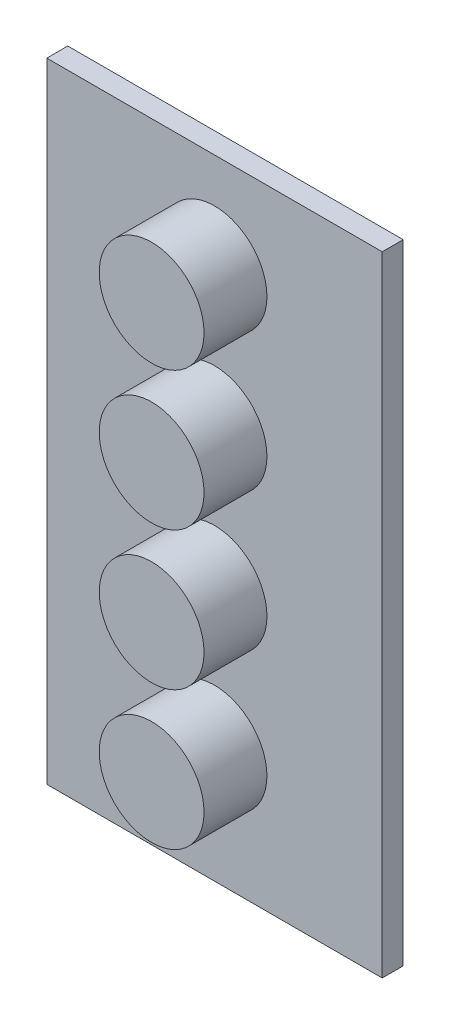
ISO-10303-21;
HEADER;
FILE_DESCRIPTION(('STEP AP214'),'2;1');
FILE_NAME('part.step','',(''),(''),'','','');
FILE_SCHEMA(('AUTOMOTIVE_DESIGN { 1 0 10303 214 1 1 1 1 }'));
ENDSEC;
DATA;
#1=APPLICATION_CONTEXT('core data for automotive mechanical design processes');
#2=APPLICATION_PROTOCOL_DEFINITION('international standard','automotive_design',2000,#1);
#3=PRODUCT_CONTEXT('',#1,'mechanical');
#4=PRODUCT('Part','Part','',(#3));
#5=PRODUCT_RELATED_PRODUCT_CATEGORY('part','',(#4));
#6=PRODUCT_DEFINITION_FORMATION('','',#4);
#7=PRODUCT_DEFINITION_CONTEXT('part definition',#1,'design');
#8=PRODUCT_DEFINITION('design','',#6,#7);
#9=PRODUCT_DEFINITION_SHAPE('','',#8);
#10=(LENGTH_UNIT() NAMED_UNIT(*) SI_UNIT(.MILLI.,.METRE.));
#11=(NAMED_UNIT(*) PLANE_ANGLE_UNIT() SI_UNIT($,.RADIAN.));
#12=(NAMED_UNIT(*) SI_UNIT($,.STERADIAN.) SOLID_ANGLE_UNIT());
#13=UNCERTAINTY_MEASURE_WITH_UNIT(LENGTH_MEASURE(1.E-05),#10,'distance_accuracy_value','');
#14=(GEOMETRIC_REPRESENTATION_CONTEXT(3) GLOBAL_UNCERTAINTY_ASSIGNED_CONTEXT((#13)) GLOBAL_UNIT_ASSIGNED_CONTEXT((#10,
#11,#12)) REPRESENTATION_CONTEXT('',''));
#15=CARTESIAN_POINT('',(0.,0.,0.));
#16=DIRECTION('',(0.,0.,1.));
#17=DIRECTION('',(1.,0.,0.));
#18=AXIS2_PLACEMENT_3D('',#15,#16,#17);
#19=CARTESIAN_POINT('',(40.,75.,5.));
#20=DIRECTION('',(-1.,0.,0.));
#21=DIRECTION('',(0.,-1.,0.));
#22=AXIS2_PLACEMENT_3D('',#19,#20,#21);
#23=PLANE('',#22);
#24=DIRECTION('',(0.,1.,0.));
#25=VECTOR('',#24,1.);
#26=CARTESIAN_POINT('',(40.,75.,0.));
#27=LINE('',#26,#25);
#28=CARTESIAN_POINT('',(40.,-75.,0.));
#29=VERTEX_POINT('',#28);
#30=CARTESIAN_POINT('',(40.,75.,0.));
#31=VERTEX_POINT('',#30);
#32=EDGE_CURVE('E97',#29,#31,#27,.T.);
#33=ORIENTED_EDGE('',*,*,#32,.T.);
#34=DIRECTION('',(0.,0.,-1.));
#35=VECTOR('',#34,1.);
#36=CARTESIAN_POINT('',(40.,75.,5.));
#37=LINE('',#36,#35);
#38=CARTESIAN_POINT('',(40.,75.,5.));
#39=VERTEX_POINT('',#38);
#40=EDGE_CURVE('E11',#39,#31,#37,.T.);
#41=ORIENTED_EDGE('',*,*,#40,.F.);
#42=DIRECTION('',(0.,1.,0.));
#43=VECTOR('',#42,1.);
#44=CARTESIAN_POINT('',(40.,75.,5.));
#45=LINE('',#44,#43);
#46=CARTESIAN_POINT('',(40.,-75.,5.));
#47=VERTEX_POINT('',#46);
#48=EDGE_CURVE('E85',#47,#39,#45,.T.);
#49=ORIENTED_EDGE('',*,*,#48,.F.);
#50=DIRECTION('',(0.,0.,-1.));
#51=VECTOR('',#50,1.);
#52=CARTESIAN_POINT('',(40.,-75.,5.));
#53=LINE('',#52,#51);
#54=EDGE_CURVE('E93',#47,#29,#53,.T.);
#55=ORIENTED_EDGE('',*,*,#54,.T.);
#56=EDGE_LOOP('',(#33,#41,#49,#55));
#57=FACE_BOUND('',#56,.T.);
#58=ADVANCED_FACE('F34',(#57),#23,.F.);
#59=CARTESIAN_POINT('',(-40.,75.,5.));
#60=DIRECTION('',(0.,-1.,0.));
#61=DIRECTION('',(0.,0.,-1.));
#62=AXIS2_PLACEMENT_3D('',#59,#60,#61);
#63=PLANE('',#62);
#64=DIRECTION('',(-1.,0.,0.));
#65=VECTOR('',#64,1.);
#66=CARTESIAN_POINT('',(-40.,75.,0.));
#67=LINE('',#66,#65);
#68=CARTESIAN_POINT('',(-40.,75.,0.));
#69=VERTEX_POINT('',#68);
#70=EDGE_CURVE('E89',#31,#69,#67,.T.);
#71=ORIENTED_EDGE('',*,*,#70,.T.);
#72=DIRECTION('',(0.,0.,-1.));
#73=VECTOR('',#72,1.);
#74=CARTESIAN_POINT('',(-40.,75.,5.));
#75=LINE('',#74,#73);
#76=CARTESIAN_POINT('',(-40.,75.,5.));
#77=VERTEX_POINT('',#76);
#78=EDGE_CURVE('E42',#77,#69,#75,.T.);
#79=ORIENTED_EDGE('',*,*,#78,.F.);
#80=DIRECTION('',(-1.,0.,0.));
#81=VECTOR('',#80,1.);
#82=CARTESIAN_POINT('',(-40.,75.,5.));
#83=LINE('',#82,#81);
#84=EDGE_CURVE('E80',#39,#77,#83,.T.);
#85=ORIENTED_EDGE('',*,*,#84,.F.);
#86=ORIENTED_EDGE('',*,*,#40,.T.);
#87=EDGE_LOOP('',(#71,#79,#85,#86));
#88=FACE_BOUND('',#87,.T.);
#89=ADVANCED_FACE('F88',(#88),#63,.F.);
#90=CARTESIAN_POINT('',(-40.,75.,5.));
#91=DIRECTION('',(1.,0.,0.));
#92=DIRECTION('',(0.,1.,0.));
#93=AXIS2_PLACEMENT_3D('',#90,#91,#92);
#94=PLANE('',#93);
#95=DIRECTION('',(0.,-1.,0.));
#96=VECTOR('',#95,1.);
#97=CARTESIAN_POINT('',(-40.,75.,0.));
#98=LINE('',#97,#96);
#99=CARTESIAN_POINT('',(-40.,-75.,0.));
#100=VERTEX_POINT('',#99);
#101=EDGE_CURVE('E67',#69,#100,#98,.T.);
#102=ORIENTED_EDGE('',*,*,#101,.T.);
#103=DIRECTION('',(0.,0.,-1.));
#104=VECTOR('',#103,1.);
#105=CARTESIAN_POINT('',(-40.,-75.,5.));
#106=LINE('',#105,#104);
#107=CARTESIAN_POINT('',(-40.,-75.,5.));
#108=VERTEX_POINT('',#107);
#109=EDGE_CURVE('E90',#108,#100,#106,.T.);
#110=ORIENTED_EDGE('',*,*,#109,.F.);
#111=DIRECTION('',(0.,-1.,0.));
#112=VECTOR('',#111,1.);
#113=CARTESIAN_POINT('',(-40.,75.,5.));
#114=LINE('',#113,#112);
#115=EDGE_CURVE('E83',#77,#108,#114,.T.);
#116=ORIENTED_EDGE('',*,*,#115,.F.);
#117=ORIENTED_EDGE('',*,*,#78,.T.);
#118=EDGE_LOOP('',(#102,#110,#116,#117));
#119=FACE_BOUND('',#118,.T.);
#120=ADVANCED_FACE('F91',(#119),#94,.F.);
#121=CARTESIAN_POINT('',(-40.,-75.,5.));
#122=DIRECTION('',(0.,1.,0.));
#123=DIRECTION('',(0.,0.,1.));
#124=AXIS2_PLACEMENT_3D('',#121,#122,#123);
#125=PLANE('',#124);
#126=DIRECTION('',(1.,0.,0.));
#127=VECTOR('',#126,1.);
#128=CARTESIAN_POINT('',(-40.,-75.,0.));
#129=LINE('',#128,#127);
#130=EDGE_CURVE('E73',#100,#29,#129,.T.);
#131=ORIENTED_EDGE('',*,*,#130,.T.);
#132=ORIENTED_EDGE('',*,*,#54,.F.);
#133=DIRECTION('',(1.,0.,0.));
#134=VECTOR('',#133,1.);
#135=CARTESIAN_POINT('',(-40.,-75.,5.));
#136=LINE('',#135,#134);
#137=EDGE_CURVE('E50',#108,#47,#136,.T.);
#138=ORIENTED_EDGE('',*,*,#137,.F.);
#139=ORIENTED_EDGE('',*,*,#109,.T.);
#140=EDGE_LOOP('',(#131,#132,#138,#139));
#141=FACE_BOUND('',#140,.T.);
#142=ADVANCED_FACE('F105',(#141),#125,.F.);
#143=CARTESIAN_POINT('',(0.,0.,5.));
#144=DIRECTION('',(0.,0.,1.));
#145=DIRECTION('',(1.,0.,0.));
#146=AXIS2_PLACEMENT_3D('',#143,#144,#145);
#147=PLANE('',#146);
#148=CARTESIAN_POINT('',(1.03696995763641E-12,-47.0187648340328,5.));
#149=DIRECTION('',(0.,0.,1.));
#150=DIRECTION('',(1.,0.,0.));
#151=AXIS2_PLACEMENT_3D('',#148,#149,#150);
#152=CIRCLE('',#151,12.5);
#153=CARTESIAN_POINT('',(12.500000000001,-47.0187648340328,5.));
#154=VERTEX_POINT('',#153);
#155=EDGE_CURVE('E129',#154,#154,#152,.T.);
#156=ORIENTED_EDGE('',*,*,#155,.F.);
#157=EDGE_LOOP('',(#156));
#158=FACE_BOUND('',#157,.T.);
#159=CARTESIAN_POINT('',(6.9131330509094E-13,-14.0187648340328,5.));
#160=DIRECTION('',(0.,0.,1.));
#161=DIRECTION('',(1.,0.,0.));
#162=AXIS2_PLACEMENT_3D('',#159,#160,#161);
#163=CIRCLE('',#162,12.5);
#164=CARTESIAN_POINT('',(12.5000000000007,-14.0187648340328,5.));
#165=VERTEX_POINT('',#164);
#166=EDGE_CURVE('E123',#165,#165,#163,.T.);
#167=ORIENTED_EDGE('',*,*,#166,.F.);
#168=EDGE_LOOP('',(#167));
#169=FACE_BOUND('',#168,.T.);
#170=CARTESIAN_POINT('',(3.4565665254547E-13,18.9812351659672,5.));
#171=DIRECTION('',(0.,0.,1.));
#172=DIRECTION('',(1.,0.,0.));
#173=AXIS2_PLACEMENT_3D('',#170,#171,#172);
#174=CIRCLE('',#173,12.5);
#175=CARTESIAN_POINT('',(12.5000000000003,18.9812351659672,5.));
#176=VERTEX_POINT('',#175);
#177=EDGE_CURVE('E117',#176,#176,#174,.T.);
#178=ORIENTED_EDGE('',*,*,#177,.F.);
#179=EDGE_LOOP('',(#178));
#180=FACE_BOUND('',#179,.T.);
#181=CARTESIAN_POINT('',(0.,51.9812351659672,5.));
#182=DIRECTION('',(0.,0.,1.));
#183=DIRECTION('',(1.,0.,0.));
#184=AXIS2_PLACEMENT_3D('',#181,#182,#183);
#185=CIRCLE('',#184,12.5);
#186=CARTESIAN_POINT('',(12.5,51.9812351659672,5.));
#187=VERTEX_POINT('',#186);
#188=EDGE_CURVE('E111',#187,#187,#185,.T.);
#189=ORIENTED_EDGE('',*,*,#188,.F.);
#190=EDGE_LOOP('',(#189));
#191=FACE_BOUND('',#190,.T.);
#192=ORIENTED_EDGE('',*,*,#48,.T.);
#193=ORIENTED_EDGE('',*,*,#84,.T.);
#194=ORIENTED_EDGE('',*,*,#115,.T.);
#195=ORIENTED_EDGE('',*,*,#137,.T.);
#196=EDGE_LOOP('',(#192,#193,#194,#195));
#197=FACE_BOUND('',#196,.T.);
#198=ADVANCED_FACE('F81',(#158,#169,#180,#191,#197),#147,.T.);
#199=CARTESIAN_POINT('',(0.,0.,0.));
#200=DIRECTION('',(0.,0.,1.));
#201=DIRECTION('',(1.,0.,0.));
#202=AXIS2_PLACEMENT_3D('',#199,#200,#201);
#203=PLANE('',#202);
#204=ORIENTED_EDGE('',*,*,#32,.F.);
#205=ORIENTED_EDGE('',*,*,#130,.F.);
#206=ORIENTED_EDGE('',*,*,#101,.F.);
#207=ORIENTED_EDGE('',*,*,#70,.F.);
#208=EDGE_LOOP('',(#204,#205,#206,#207));
#209=FACE_BOUND('',#208,.T.);
#210=ADVANCED_FACE('F108',(#209),#203,.F.);
#211=CARTESIAN_POINT('',(0.,51.9812351659672,20.));
#212=DIRECTION('',(0.,0.,-1.));
#213=DIRECTION('',(-1.,0.,0.));
#214=AXIS2_PLACEMENT_3D('',#211,#212,#213);
#215=CYLINDRICAL_SURFACE('',#214,12.5);
#216=CARTESIAN_POINT('',(0.,51.9812351659672,20.));
#217=DIRECTION('',(0.,0.,1.));
#218=DIRECTION('',(1.,0.,0.));
#219=AXIS2_PLACEMENT_3D('',#216,#217,#218);
#220=CIRCLE('',#219,12.5);
#221=CARTESIAN_POINT('',(12.5,51.9812351659672,20.));
#222=VERTEX_POINT('',#221);
#223=EDGE_CURVE('E100',#222,#222,#220,.T.);
#224=ORIENTED_EDGE('',*,*,#223,.F.);
#225=EDGE_LOOP('',(#224));
#226=FACE_BOUND('',#225,.T.);
#227=ORIENTED_EDGE('',*,*,#188,.T.);
#228=EDGE_LOOP('',(#227));
#229=FACE_BOUND('',#228,.T.);
#230=ADVANCED_FACE('F153',(#226,#229),#215,.T.);
#231=CARTESIAN_POINT('',(0.,51.9812351659672,20.));
#232=DIRECTION('',(0.,0.,1.));
#233=DIRECTION('',(1.,0.,0.));
#234=AXIS2_PLACEMENT_3D('',#231,#232,#233);
#235=PLANE('',#234);
#236=ORIENTED_EDGE('',*,*,#223,.T.);
#237=EDGE_LOOP('',(#236));
#238=FACE_BOUND('',#237,.T.);
#239=ADVANCED_FACE('F155',(#238),#235,.T.);
#240=CARTESIAN_POINT('',(3.4565665254547E-13,18.9812351659672,20.));
#241=DIRECTION('',(0.,0.,-1.));
#242=DIRECTION('',(-1.,0.,0.));
#243=AXIS2_PLACEMENT_3D('',#240,#241,#242);
#244=CYLINDRICAL_SURFACE('',#243,12.5);
#245=CARTESIAN_POINT('',(3.4565665254547E-13,18.9812351659672,20.));
#246=DIRECTION('',(0.,0.,1.));
#247=DIRECTION('',(1.,0.,0.));
#248=AXIS2_PLACEMENT_3D('',#245,#246,#247);
#249=CIRCLE('',#248,12.5);
#250=CARTESIAN_POINT('',(12.5000000000003,18.9812351659672,20.));
#251=VERTEX_POINT('',#250);
#252=EDGE_CURVE('E114',#251,#251,#249,.T.);
#253=ORIENTED_EDGE('',*,*,#252,.F.);
#254=EDGE_LOOP('',(#253));
#255=FACE_BOUND('',#254,.T.);
#256=ORIENTED_EDGE('',*,*,#177,.T.);
#257=EDGE_LOOP('',(#256));
#258=FACE_BOUND('',#257,.T.);
#259=ADVANCED_FACE('F162',(#255,#258),#244,.T.);
#260=CARTESIAN_POINT('',(3.4565665254547E-13,18.9812351659672,20.));
#261=DIRECTION('',(0.,0.,1.));
#262=DIRECTION('',(1.,0.,0.));
#263=AXIS2_PLACEMENT_3D('',#260,#261,#262);
#264=PLANE('',#263);
#265=ORIENTED_EDGE('',*,*,#252,.T.);
#266=EDGE_LOOP('',(#265));
#267=FACE_BOUND('',#266,.T.);
#268=ADVANCED_FACE('F212',(#267),#264,.T.);
#269=CARTESIAN_POINT('',(6.9131330509094E-13,-14.0187648340328,20.));
#270=DIRECTION('',(0.,0.,-1.));
#271=DIRECTION('',(-1.,0.,0.));
#272=AXIS2_PLACEMENT_3D('',#269,#270,#271);
#273=CYLINDRICAL_SURFACE('',#272,12.5);
#274=CARTESIAN_POINT('',(6.9131330509094E-13,-14.0187648340328,20.));
#275=DIRECTION('',(0.,0.,1.));
#276=DIRECTION('',(1.,0.,0.));
#277=AXIS2_PLACEMENT_3D('',#274,#275,#276);
#278=CIRCLE('',#277,12.5);
#279=CARTESIAN_POINT('',(12.5000000000007,-14.0187648340328,20.));
#280=VERTEX_POINT('',#279);
#281=EDGE_CURVE('E120',#280,#280,#278,.T.);
#282=ORIENTED_EDGE('',*,*,#281,.F.);
#283=EDGE_LOOP('',(#282));
#284=FACE_BOUND('',#283,.T.);
#285=ORIENTED_EDGE('',*,*,#166,.T.);
#286=EDGE_LOOP('',(#285));
#287=FACE_BOUND('',#286,.T.);
#288=ADVANCED_FACE('F222',(#284,#287),#273,.T.);
#289=CARTESIAN_POINT('',(6.9131330509094E-13,-14.0187648340328,20.));
#290=DIRECTION('',(0.,0.,1.));
#291=DIRECTION('',(1.,0.,0.));
#292=AXIS2_PLACEMENT_3D('',#289,#290,#291);
#293=PLANE('',#292);
#294=ORIENTED_EDGE('',*,*,#281,.T.);
#295=EDGE_LOOP('',(#294));
#296=FACE_BOUND('',#295,.T.);
#297=ADVANCED_FACE('F140',(#296),#293,.T.);
#298=CARTESIAN_POINT('',(1.03696995763641E-12,-47.0187648340328,20.));
#299=DIRECTION('',(0.,0.,-1.));
#300=DIRECTION('',(-1.,0.,0.));
#301=AXIS2_PLACEMENT_3D('',#298,#299,#300);
#302=CYLINDRICAL_SURFACE('',#301,12.5);
#303=CARTESIAN_POINT('',(1.03696995763641E-12,-47.0187648340328,20.));
#304=DIRECTION('',(0.,0.,1.));
#305=DIRECTION('',(1.,0.,0.));
#306=AXIS2_PLACEMENT_3D('',#303,#304,#305);
#307=CIRCLE('',#306,12.5);
#308=CARTESIAN_POINT('',(12.500000000001,-47.0187648340328,20.));
#309=VERTEX_POINT('',#308);
#310=EDGE_CURVE('E126',#309,#309,#307,.T.);
#311=ORIENTED_EDGE('',*,*,#310,.F.);
#312=EDGE_LOOP('',(#311));
#313=FACE_BOUND('',#312,.T.);
#314=ORIENTED_EDGE('',*,*,#155,.T.);
#315=EDGE_LOOP('',(#314));
#316=FACE_BOUND('',#315,.T.);
#317=ADVANCED_FACE('F137',(#313,#316),#302,.T.);
#318=CARTESIAN_POINT('',(1.03696995763641E-12,-47.0187648340328,20.));
#319=DIRECTION('',(0.,0.,1.));
#320=DIRECTION('',(1.,0.,0.));
#321=AXIS2_PLACEMENT_3D('',#318,#319,#320);
#322=PLANE('',#321);
#323=ORIENTED_EDGE('',*,*,#310,.T.);
#324=EDGE_LOOP('',(#323));
#325=FACE_BOUND('',#324,.T.);
#326=ADVANCED_FACE('F135',(#325),#322,.T.);
#327=CLOSED_SHELL('',(#58,#89,#120,#142,#198,#210,#230,#239,#259,#268,#288,#297,#317,#326));
#328=MANIFOLD_SOLID_BREP('B2',#327);
#329=ADVANCED_BREP_SHAPE_REPRESENTATION('',(#18,#328),#14);
#330=SHAPE_DEFINITION_REPRESENTATION(#9,#329);
ENDSEC;
END-ISO-10303-21;
